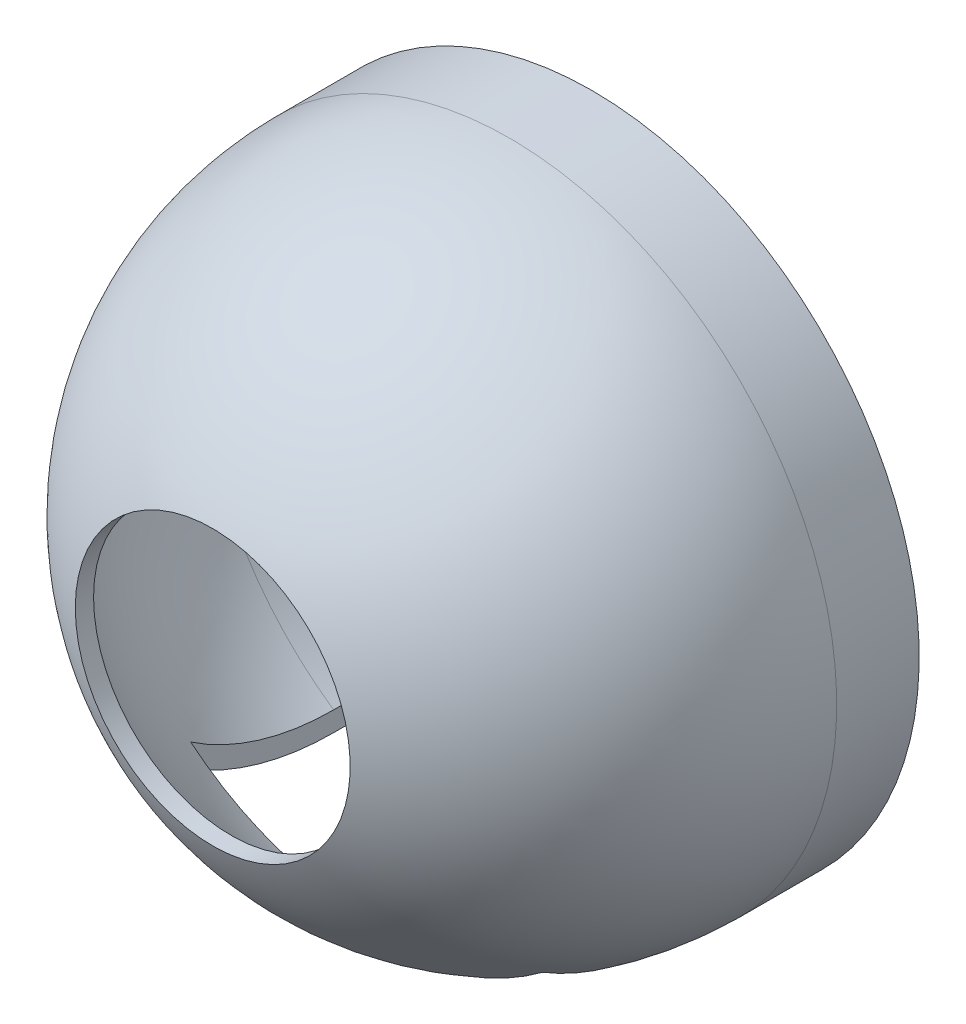
ISO-10303-21;
HEADER;
FILE_DESCRIPTION(('STEP AP214'),'2;1');
FILE_NAME('part.step','',(''),(''),'','','');
FILE_SCHEMA(('AUTOMOTIVE_DESIGN { 1 0 10303 214 1 1 1 1 }'));
ENDSEC;
DATA;
#1=APPLICATION_CONTEXT('core data for automotive mechanical design processes');
#2=APPLICATION_PROTOCOL_DEFINITION('international standard','automotive_design',2000,#1);
#3=PRODUCT_CONTEXT('',#1,'mechanical');
#4=PRODUCT('Part','Part','',(#3));
#5=PRODUCT_RELATED_PRODUCT_CATEGORY('part','',(#4));
#6=PRODUCT_DEFINITION_FORMATION('','',#4);
#7=PRODUCT_DEFINITION_CONTEXT('part definition',#1,'design');
#8=PRODUCT_DEFINITION('design','',#6,#7);
#9=PRODUCT_DEFINITION_SHAPE('','',#8);
#10=(LENGTH_UNIT() NAMED_UNIT(*) SI_UNIT(.MILLI.,.METRE.));
#11=(NAMED_UNIT(*) PLANE_ANGLE_UNIT() SI_UNIT($,.RADIAN.));
#12=(NAMED_UNIT(*) SI_UNIT($,.STERADIAN.) SOLID_ANGLE_UNIT());
#13=UNCERTAINTY_MEASURE_WITH_UNIT(LENGTH_MEASURE(1.E-05),#10,'distance_accuracy_value','');
#14=(GEOMETRIC_REPRESENTATION_CONTEXT(3) GLOBAL_UNCERTAINTY_ASSIGNED_CONTEXT((#13)) GLOBAL_UNIT_ASSIGNED_CONTEXT((#10,
#11,#12)) REPRESENTATION_CONTEXT('',''));
#15=CARTESIAN_POINT('',(0.,0.,0.));
#16=DIRECTION('',(0.,0.,1.));
#17=DIRECTION('',(1.,0.,0.));
#18=AXIS2_PLACEMENT_3D('',#15,#16,#17);
#19=CARTESIAN_POINT('',(0.,0.,-147.580335522369));
#20=DIRECTION('',(0.,0.,-1.));
#21=DIRECTION('',(-1.,0.,0.));
#22=AXIS2_PLACEMENT_3D('',#19,#20,#21);
#23=PLANE('',#22);
#24=DIRECTION('',(0.,1.,0.));
#25=VECTOR('',#24,1.);
#26=CARTESIAN_POINT('',(-32.,-59.5,-147.580335522369));
#27=LINE('',#26,#25);
#28=CARTESIAN_POINT('',(-32.,-50.1622367922325,-147.580335522369));
#29=VERTEX_POINT('',#28);
#30=CARTESIAN_POINT('',(-32.,-46.5644714347752,-147.580335522369));
#31=VERTEX_POINT('',#30);
#32=EDGE_CURVE('E92',#29,#31,#27,.T.);
#33=ORIENTED_EDGE('',*,*,#32,.F.);
#34=CARTESIAN_POINT('',(0.,0.,-147.580335522369));
#35=DIRECTION('',(0.,0.,-1.));
#36=DIRECTION('',(-1.,0.,0.));
#37=AXIS2_PLACEMENT_3D('',#34,#35,#36);
#38=CIRCLE('',#37,59.5);
#39=CARTESIAN_POINT('',(32.,-50.1622367922324,-147.580335522369));
#40=VERTEX_POINT('',#39);
#41=EDGE_CURVE('E121',#29,#40,#38,.T.);
#42=ORIENTED_EDGE('',*,*,#41,.T.);
#43=DIRECTION('',(0.,1.,0.));
#44=VECTOR('',#43,1.);
#45=CARTESIAN_POINT('',(32.,-59.5,-147.580335522369));
#46=LINE('',#45,#44);
#47=CARTESIAN_POINT('',(32.,-46.5644714347752,-147.580335522369));
#48=VERTEX_POINT('',#47);
#49=EDGE_CURVE('E142',#40,#48,#46,.T.);
#50=ORIENTED_EDGE('',*,*,#49,.T.);
#51=CARTESIAN_POINT('',(0.,0.,-147.580335522369));
#52=DIRECTION('',(0.,0.,-1.));
#53=DIRECTION('',(-1.,0.,0.));
#54=AXIS2_PLACEMENT_3D('',#51,#52,#53);
#55=CIRCLE('',#54,56.5);
#56=EDGE_CURVE('E117',#31,#48,#55,.T.);
#57=ORIENTED_EDGE('',*,*,#56,.F.);
#58=EDGE_LOOP('',(#33,#42,#50,#57));
#59=FACE_BOUND('',#58,.T.);
#60=ADVANCED_FACE('F33',(#59),#23,.T.);
#61=CARTESIAN_POINT('',(0.,0.,-76.0803355223686));
#62=DIRECTION('',(0.,0.,-1.));
#63=DIRECTION('',(-1.,0.,0.));
#64=AXIS2_PLACEMENT_3D('',#61,#62,#63);
#65=CYLINDRICAL_SURFACE('',#64,59.5);
#66=DIRECTION('',(0.,0.,-1.));
#67=VECTOR('',#66,1.);
#68=CARTESIAN_POINT('',(-32.,-50.1622367922325,-76.0803355223686));
#69=LINE('',#68,#67);
#70=CARTESIAN_POINT('',(-32.,-50.1622367922325,-132.580335522369));
#71=VERTEX_POINT('',#70);
#72=EDGE_CURVE('E101',#71,#29,#69,.T.);
#73=ORIENTED_EDGE('',*,*,#72,.F.);
#74=CARTESIAN_POINT('',(0.,0.,-132.580335522369));
#75=DIRECTION('',(0.,0.,-1.));
#76=DIRECTION('',(-1.,0.,0.));
#77=AXIS2_PLACEMENT_3D('',#74,#75,#76);
#78=CIRCLE('',#77,59.5);
#79=CARTESIAN_POINT('',(32.,-50.1622367922325,-132.580335522369));
#80=VERTEX_POINT('',#79);
#81=EDGE_CURVE('E100',#71,#80,#78,.T.);
#82=ORIENTED_EDGE('',*,*,#81,.T.);
#83=DIRECTION('',(0.,0.,-1.));
#84=VECTOR('',#83,1.);
#85=CARTESIAN_POINT('',(32.,-50.1622367922324,-76.0803355223686));
#86=LINE('',#85,#84);
#87=EDGE_CURVE('E107',#40,#80,#86,.F.);
#88=ORIENTED_EDGE('',*,*,#87,.F.);
#89=ORIENTED_EDGE('',*,*,#41,.F.);
#90=EDGE_LOOP('',(#73,#82,#88,#89));
#91=FACE_BOUND('',#90,.T.);
#92=ADVANCED_FACE('F145',(#91),#65,.T.);
#93=CARTESIAN_POINT('',(0.,0.,-132.580335522369));
#94=DIRECTION('',(0.,0.,-1.));
#95=DIRECTION('',(0.,1.,0.));
#96=AXIS2_PLACEMENT_3D('',#93,#94,#95);
#97=SPHERICAL_SURFACE('',#96,59.5);
#98=CARTESIAN_POINT('',(-32.,0.,-132.580335522369));
#99=DIRECTION('',(-1.,0.,0.));
#100=DIRECTION('',(0.,0.,1.));
#101=AXIS2_PLACEMENT_3D('',#98,#99,#100);
#102=CIRCLE('',#101,50.1622367922325);
#103=CARTESIAN_POINT('',(-32.,-42.8981351576033,-106.580335522369));
#104=VERTEX_POINT('',#103);
#105=EDGE_CURVE('E55',#104,#71,#102,.F.);
#106=ORIENTED_EDGE('',*,*,#105,.F.);
#107=CARTESIAN_POINT('',(0.,0.,-106.580335522369));
#108=DIRECTION('',(0.,0.,1.));
#109=DIRECTION('',(1.,0.,0.));
#110=AXIS2_PLACEMENT_3D('',#107,#108,#109);
#111=CIRCLE('',#110,53.5186883247338);
#112=CARTESIAN_POINT('',(32.,-42.8981351576033,-106.580335522369));
#113=VERTEX_POINT('',#112);
#114=EDGE_CURVE('E85',#113,#104,#111,.F.);
#115=ORIENTED_EDGE('',*,*,#114,.F.);
#116=CARTESIAN_POINT('',(32.,0.,-132.580335522369));
#117=DIRECTION('',(1.,0.,0.));
#118=DIRECTION('',(0.,0.,-1.));
#119=AXIS2_PLACEMENT_3D('',#116,#117,#118);
#120=CIRCLE('',#119,50.1622367922325);
#121=EDGE_CURVE('E138',#80,#113,#120,.F.);
#122=ORIENTED_EDGE('',*,*,#121,.F.);
#123=ORIENTED_EDGE('',*,*,#81,.F.);
#124=EDGE_LOOP('',(#106,#115,#122,#123));
#125=FACE_BOUND('',#124,.T.);
#126=CARTESIAN_POINT('',(0.,0.,-78.5872804134012));
#127=DIRECTION('',(0.,0.,-1.));
#128=DIRECTION('',(-1.,0.,0.));
#129=AXIS2_PLACEMENT_3D('',#126,#127,#128);
#130=CIRCLE('',#129,25.);
#131=CARTESIAN_POINT('',(-25.,0.,-78.5872804134012));
#132=VERTEX_POINT('',#131);
#133=EDGE_CURVE('E111',#132,#132,#130,.F.);
#134=ORIENTED_EDGE('',*,*,#133,.F.);
#135=EDGE_LOOP('',(#134));
#136=FACE_BOUND('',#135,.T.);
#137=ADVANCED_FACE('F35',(#125,#136),#97,.T.);
#138=CARTESIAN_POINT('',(0.,0.,-76.0803355223686));
#139=DIRECTION('',(0.,0.,-1.));
#140=DIRECTION('',(-1.,0.,0.));
#141=AXIS2_PLACEMENT_3D('',#138,#139,#140);
#142=CYLINDRICAL_SURFACE('',#141,56.5);
#143=CARTESIAN_POINT('',(0.,0.,-132.580335522369));
#144=DIRECTION('',(0.,0.,-1.));
#145=DIRECTION('',(-1.,0.,0.));
#146=AXIS2_PLACEMENT_3D('',#143,#144,#145);
#147=CIRCLE('',#146,56.5);
#148=CARTESIAN_POINT('',(-32.,-46.5644714347752,-132.580335522369));
#149=VERTEX_POINT('',#148);
#150=CARTESIAN_POINT('',(32.,-46.5644714347752,-132.580335522369));
#151=VERTEX_POINT('',#150);
#152=EDGE_CURVE('E114',#149,#151,#147,.T.);
#153=ORIENTED_EDGE('',*,*,#152,.F.);
#154=DIRECTION('',(0.,0.,-1.));
#155=VECTOR('',#154,1.);
#156=CARTESIAN_POINT('',(-32.,-46.5644714347752,-76.0803355223686));
#157=LINE('',#156,#155);
#158=EDGE_CURVE('E102',#149,#31,#157,.T.);
#159=ORIENTED_EDGE('',*,*,#158,.T.);
#160=ORIENTED_EDGE('',*,*,#56,.T.);
#161=DIRECTION('',(0.,0.,-1.));
#162=VECTOR('',#161,1.);
#163=CARTESIAN_POINT('',(32.,-46.5644714347752,-76.0803355223686));
#164=LINE('',#163,#162);
#165=EDGE_CURVE('E91',#48,#151,#164,.F.);
#166=ORIENTED_EDGE('',*,*,#165,.T.);
#167=EDGE_LOOP('',(#153,#159,#160,#166));
#168=FACE_BOUND('',#167,.T.);
#169=ADVANCED_FACE('F136',(#168),#142,.F.);
#170=CARTESIAN_POINT('',(0.,0.,-132.580335522369));
#171=DIRECTION('',(0.,0.,-1.));
#172=DIRECTION('',(0.,1.,0.));
#173=AXIS2_PLACEMENT_3D('',#170,#171,#172);
#174=SPHERICAL_SURFACE('',#173,56.5);
#175=CARTESIAN_POINT('',(0.,0.,-81.912298260205));
#176=DIRECTION('',(0.,0.,-1.));
#177=DIRECTION('',(-1.,0.,0.));
#178=AXIS2_PLACEMENT_3D('',#175,#176,#177);
#179=CIRCLE('',#178,25.);
#180=CARTESIAN_POINT('',(-25.,0.,-81.912298260205));
#181=VERTEX_POINT('',#180);
#182=EDGE_CURVE('E104',#181,#181,#179,.F.);
#183=ORIENTED_EDGE('',*,*,#182,.T.);
#184=EDGE_LOOP('',(#183));
#185=FACE_BOUND('',#184,.T.);
#186=CARTESIAN_POINT('',(0.,0.,-106.580335522369));
#187=DIRECTION('',(0.,0.,1.));
#188=DIRECTION('',(1.,0.,0.));
#189=AXIS2_PLACEMENT_3D('',#186,#187,#188);
#190=CIRCLE('',#189,50.1622367922325);
#191=CARTESIAN_POINT('',(32.,-38.6296518234374,-106.580335522369));
#192=VERTEX_POINT('',#191);
#193=CARTESIAN_POINT('',(-32.,-38.6296518234374,-106.580335522369));
#194=VERTEX_POINT('',#193);
#195=EDGE_CURVE('E124',#192,#194,#190,.F.);
#196=ORIENTED_EDGE('',*,*,#195,.T.);
#197=CARTESIAN_POINT('',(-32.,0.,-132.580335522369));
#198=DIRECTION('',(-1.,0.,0.));
#199=DIRECTION('',(0.,0.,1.));
#200=AXIS2_PLACEMENT_3D('',#197,#198,#199);
#201=CIRCLE('',#200,46.5644714347752);
#202=EDGE_CURVE('E11',#194,#149,#201,.F.);
#203=ORIENTED_EDGE('',*,*,#202,.T.);
#204=ORIENTED_EDGE('',*,*,#152,.T.);
#205=CARTESIAN_POINT('',(32.,0.,-132.580335522369));
#206=DIRECTION('',(1.,0.,0.));
#207=DIRECTION('',(0.,0.,-1.));
#208=AXIS2_PLACEMENT_3D('',#205,#206,#207);
#209=CIRCLE('',#208,46.5644714347752);
#210=EDGE_CURVE('E41',#151,#192,#209,.F.);
#211=ORIENTED_EDGE('',*,*,#210,.T.);
#212=EDGE_LOOP('',(#196,#203,#204,#211));
#213=FACE_BOUND('',#212,.T.);
#214=ADVANCED_FACE('F129',(#185,#213),#174,.F.);
#215=CARTESIAN_POINT('',(0.,0.,-147.580335522369));
#216=DIRECTION('',(0.,0.,1.));
#217=DIRECTION('',(1.,0.,0.));
#218=AXIS2_PLACEMENT_3D('',#215,#216,#217);
#219=CYLINDRICAL_SURFACE('',#218,25.);
#220=ORIENTED_EDGE('',*,*,#133,.T.);
#221=EDGE_LOOP('',(#220));
#222=FACE_BOUND('',#221,.T.);
#223=ORIENTED_EDGE('',*,*,#182,.F.);
#224=EDGE_LOOP('',(#223));
#225=FACE_BOUND('',#224,.T.);
#226=ADVANCED_FACE('F161',(#222,#225),#219,.F.);
#227=CARTESIAN_POINT('',(-32.,-59.5,-147.580335522369));
#228=DIRECTION('',(-1.,0.,0.));
#229=DIRECTION('',(0.,0.,1.));
#230=AXIS2_PLACEMENT_3D('',#227,#228,#229);
#231=PLANE('',#230);
#232=ORIENTED_EDGE('',*,*,#72,.T.);
#233=ORIENTED_EDGE('',*,*,#32,.T.);
#234=ORIENTED_EDGE('',*,*,#158,.F.);
#235=ORIENTED_EDGE('',*,*,#202,.F.);
#236=DIRECTION('',(0.,1.,0.));
#237=VECTOR('',#236,1.);
#238=CARTESIAN_POINT('',(-32.,-59.5,-106.580335522369));
#239=LINE('',#238,#237);
#240=EDGE_CURVE('E48',#104,#194,#239,.T.);
#241=ORIENTED_EDGE('',*,*,#240,.F.);
#242=ORIENTED_EDGE('',*,*,#105,.T.);
#243=EDGE_LOOP('',(#232,#233,#234,#235,#241,#242));
#244=FACE_BOUND('',#243,.T.);
#245=ADVANCED_FACE('F94',(#244),#231,.F.);
#246=CARTESIAN_POINT('',(32.,-59.5,-147.580335522369));
#247=DIRECTION('',(1.,0.,0.));
#248=DIRECTION('',(0.,0.,-1.));
#249=AXIS2_PLACEMENT_3D('',#246,#247,#248);
#250=PLANE('',#249);
#251=ORIENTED_EDGE('',*,*,#87,.T.);
#252=ORIENTED_EDGE('',*,*,#121,.T.);
#253=DIRECTION('',(0.,1.,0.));
#254=VECTOR('',#253,1.);
#255=CARTESIAN_POINT('',(32.,-59.5,-106.580335522369));
#256=LINE('',#255,#254);
#257=EDGE_CURVE('E88',#113,#192,#256,.T.);
#258=ORIENTED_EDGE('',*,*,#257,.T.);
#259=ORIENTED_EDGE('',*,*,#210,.F.);
#260=ORIENTED_EDGE('',*,*,#165,.F.);
#261=ORIENTED_EDGE('',*,*,#49,.F.);
#262=EDGE_LOOP('',(#251,#252,#258,#259,#260,#261));
#263=FACE_BOUND('',#262,.T.);
#264=ADVANCED_FACE('F133',(#263),#250,.F.);
#265=CARTESIAN_POINT('',(-32.,-59.5,-106.580335522369));
#266=DIRECTION('',(0.,0.,1.));
#267=DIRECTION('',(1.,0.,0.));
#268=AXIS2_PLACEMENT_3D('',#265,#266,#267);
#269=PLANE('',#268);
#270=ORIENTED_EDGE('',*,*,#114,.T.);
#271=ORIENTED_EDGE('',*,*,#240,.T.);
#272=ORIENTED_EDGE('',*,*,#195,.F.);
#273=ORIENTED_EDGE('',*,*,#257,.F.);
#274=EDGE_LOOP('',(#270,#271,#272,#273));
#275=FACE_BOUND('',#274,.T.);
#276=ADVANCED_FACE('F86',(#275),#269,.F.);
#277=CLOSED_SHELL('',(#60,#92,#137,#169,#214,#226,#245,#264,#276));
#278=MANIFOLD_SOLID_BREP('B2',#277);
#279=ADVANCED_BREP_SHAPE_REPRESENTATION('',(#18,#278),#14);
#280=SHAPE_DEFINITION_REPRESENTATION(#9,#279);
ENDSEC;
END-ISO-10303-21;
